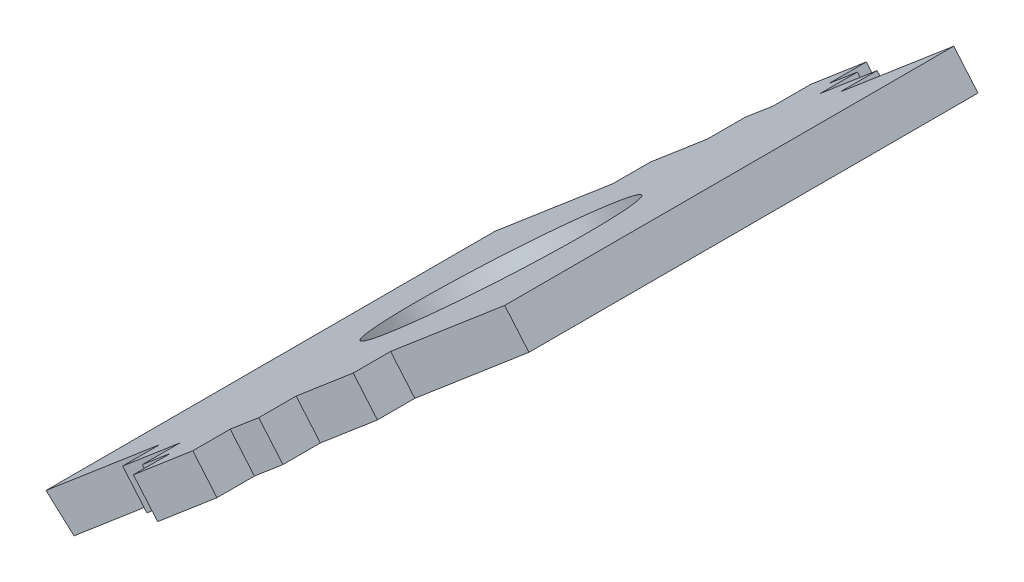
ISO-10303-21;
HEADER;
FILE_DESCRIPTION(('STEP AP214'),'2;1');
FILE_NAME('part.step','',(''),(''),'','','');
FILE_SCHEMA(('AUTOMOTIVE_DESIGN { 1 0 10303 214 1 1 1 1 }'));
ENDSEC;
DATA;
#1=APPLICATION_CONTEXT('core data for automotive mechanical design processes');
#2=APPLICATION_PROTOCOL_DEFINITION('international standard','automotive_design',2000,#1);
#3=PRODUCT_CONTEXT('',#1,'mechanical');
#4=PRODUCT('Part','Part','',(#3));
#5=PRODUCT_RELATED_PRODUCT_CATEGORY('part','',(#4));
#6=PRODUCT_DEFINITION_FORMATION('','',#4);
#7=PRODUCT_DEFINITION_CONTEXT('part definition',#1,'design');
#8=PRODUCT_DEFINITION('design','',#6,#7);
#9=PRODUCT_DEFINITION_SHAPE('','',#8);
#10=(LENGTH_UNIT() NAMED_UNIT(*) SI_UNIT(.MILLI.,.METRE.));
#11=(NAMED_UNIT(*) PLANE_ANGLE_UNIT() SI_UNIT($,.RADIAN.));
#12=(NAMED_UNIT(*) SI_UNIT($,.STERADIAN.) SOLID_ANGLE_UNIT());
#13=UNCERTAINTY_MEASURE_WITH_UNIT(LENGTH_MEASURE(1.E-05),#10,'distance_accuracy_value','');
#14=(GEOMETRIC_REPRESENTATION_CONTEXT(3) GLOBAL_UNCERTAINTY_ASSIGNED_CONTEXT((#13)) GLOBAL_UNIT_ASSIGNED_CONTEXT((#10,
#11,#12)) REPRESENTATION_CONTEXT('',''));
#15=CARTESIAN_POINT('',(0.,0.,0.));
#16=DIRECTION('',(0.,0.,1.));
#17=DIRECTION('',(1.,0.,0.));
#18=AXIS2_PLACEMENT_3D('',#15,#16,#17);
#19=CARTESIAN_POINT('',(-106.481154517349,295.978206086416,-9.525));
#20=DIRECTION('',(-0.762165840447724,-0.647381828332101,0.));
#21=DIRECTION('',(0.647381828332101,-0.762165840447724,0.));
#22=AXIS2_PLACEMENT_3D('',#19,#20,#21);
#23=PLANE('',#22);
#24=DIRECTION('',(0.,0.,1.));
#25=VECTOR('',#24,1.);
#26=CARTESIAN_POINT('',(-106.481154517349,295.978206086416,-9.525));
#27=LINE('',#26,#25);
#28=CARTESIAN_POINT('',(-106.481154517349,295.978206086416,0.));
#29=VERTEX_POINT('',#28);
#30=CARTESIAN_POINT('',(-106.481154517349,295.978206086416,38.1));
#31=VERTEX_POINT('',#30);
#32=EDGE_CURVE('E374',#29,#31,#27,.T.);
#33=ORIENTED_EDGE('',*,*,#32,.T.);
#34=DIRECTION('',(0.647381828332101,-0.762165840447724,0.));
#35=VECTOR('',#34,1.);
#36=CARTESIAN_POINT('',(-106.481154517349,295.978206086416,38.1));
#37=LINE('',#36,#35);
#38=CARTESIAN_POINT('',(-104.425717212394,293.558329542994,38.1));
#39=VERTEX_POINT('',#38);
#40=EDGE_CURVE('E329',#31,#39,#37,.T.);
#41=ORIENTED_EDGE('',*,*,#40,.T.);
#42=DIRECTION('',(0.,0.,1.));
#43=VECTOR('',#42,1.);
#44=CARTESIAN_POINT('',(-104.425717212394,293.558329542994,-9.525));
#45=LINE('',#44,#43);
#46=CARTESIAN_POINT('',(-104.425717212394,293.558329542994,0.));
#47=VERTEX_POINT('',#46);
#48=EDGE_CURVE('E382',#47,#39,#45,.T.);
#49=ORIENTED_EDGE('',*,*,#48,.F.);
#50=DIRECTION('',(-0.647381828332101,0.762165840447724,0.));
#51=VECTOR('',#50,1.);
#52=CARTESIAN_POINT('',(-106.481154517349,295.978206086416,0.));
#53=LINE('',#52,#51);
#54=EDGE_CURVE('E362',#47,#29,#53,.T.);
#55=ORIENTED_EDGE('',*,*,#54,.T.);
#56=EDGE_LOOP('',(#33,#41,#49,#55));
#57=FACE_BOUND('',#56,.T.);
#58=ADVANCED_FACE('F33',(#57),#23,.F.);
#59=CARTESIAN_POINT('',(-104.425717212394,293.558329542994,-9.525));
#60=DIRECTION('',(-0.647381828332102,0.762165840447724,0.));
#61=DIRECTION('',(-0.762165840447724,-0.647381828332102,0.));
#62=AXIS2_PLACEMENT_3D('',#59,#60,#61);
#63=PLANE('',#62);
#64=CARTESIAN_POINT('',(-123.784729559767,277.114831103359,19.05));
#65=DIRECTION('',(0.647381828332102,-0.762165840447724,0.));
#66=DIRECTION('',(0.762165840447724,0.647381828332102,0.));
#67=AXIS2_PLACEMENT_3D('',#64,#65,#66);
#68=CIRCLE('',#67,9.52500000000003);
#69=CARTESIAN_POINT('',(-116.525099929502,283.281143018222,19.05));
#70=VERTEX_POINT('',#69);
#71=EDGE_CURVE('E798',#70,#70,#68,.T.);
#72=ORIENTED_EDGE('',*,*,#71,.F.);
#73=EDGE_LOOP('',(#72));
#74=FACE_BOUND('',#73,.T.);
#75=DIRECTION('',(-0.762165840447724,-0.647381828332101,0.));
#76=VECTOR('',#75,1.);
#77=CARTESIAN_POINT('',(-104.425717212394,293.558329542994,47.625));
#78=LINE('',#77,#76);
#79=CARTESIAN_POINT('',(-121.364853016345,279.170268408313,47.625));
#80=VERTEX_POINT('',#79);
#81=CARTESIAN_POINT('',(-126.403407566219,274.890532314745,47.625));
#82=VERTEX_POINT('',#81);
#83=EDGE_CURVE('E365',#80,#82,#78,.T.);
#84=ORIENTED_EDGE('',*,*,#83,.T.);
#85=DIRECTION('',(0.,0.,1.));
#86=VECTOR('',#85,1.);
#87=CARTESIAN_POINT('',(-126.403407566219,274.890532314745,47.625));
#88=LINE('',#87,#86);
#89=CARTESIAN_POINT('',(-126.403407566219,274.890532314745,44.4499999992842));
#90=VERTEX_POINT('',#89);
#91=EDGE_CURVE('E48',#90,#82,#88,.T.);
#92=ORIENTED_EDGE('',*,*,#91,.F.);
#93=DIRECTION('',(0.76216584044772,0.647381828332106,0.));
#94=VECTOR('',#93,1.);
#95=CARTESIAN_POINT('',(-128.823284109641,272.835095009791,44.4499999992842));
#96=LINE('',#95,#94);
#97=CARTESIAN_POINT('',(-128.823284109641,272.835095009791,44.4499999992842));
#98=VERTEX_POINT('',#97);
#99=EDGE_CURVE('E253',#98,#90,#96,.T.);
#100=ORIENTED_EDGE('',*,*,#99,.F.);
#101=DIRECTION('',(0.,0.,1.));
#102=VECTOR('',#101,1.);
#103=CARTESIAN_POINT('',(-128.823284109641,272.835095009791,44.4499999992842));
#104=LINE('',#103,#102);
#105=CARTESIAN_POINT('',(-128.823284109641,272.835095009791,41.2749999996421));
#106=VERTEX_POINT('',#105);
#107=EDGE_CURVE('E247',#106,#98,#104,.T.);
#108=ORIENTED_EDGE('',*,*,#107,.F.);
#109=DIRECTION('',(0.762165840447724,0.647381828332101,0.));
#110=VECTOR('',#109,1.);
#111=CARTESIAN_POINT('',(-133.663037196484,268.724220399882,41.2749999996421));
#112=LINE('',#111,#110);
#113=CARTESIAN_POINT('',(-133.663037196484,268.724220399882,41.2749999996421));
#114=VERTEX_POINT('',#113);
#115=EDGE_CURVE('E245',#114,#106,#112,.T.);
#116=ORIENTED_EDGE('',*,*,#115,.F.);
#117=DIRECTION('',(0.,0.,1.));
#118=VECTOR('',#117,1.);
#119=CARTESIAN_POINT('',(-133.663037196484,268.724220399882,41.2749999996421));
#120=LINE('',#119,#118);
#121=CARTESIAN_POINT('',(-133.663037196484,268.724220399882,38.1));
#122=VERTEX_POINT('',#121);
#123=EDGE_CURVE('E224',#122,#114,#120,.T.);
#124=ORIENTED_EDGE('',*,*,#123,.F.);
#125=DIRECTION('',(0.762165840447725,0.6473818283321,0.));
#126=VECTOR('',#125,1.);
#127=CARTESIAN_POINT('',(-143.34254337017,260.502471180064,38.1));
#128=LINE('',#127,#126);
#129=CARTESIAN_POINT('',(-143.022728413072,260.774121233985,38.1));
#130=VERTEX_POINT('',#129);
#131=EDGE_CURVE('E233',#130,#122,#128,.T.);
#132=ORIENTED_EDGE('',*,*,#131,.F.);
#133=DIRECTION('',(0.,0.,1.));
#134=VECTOR('',#133,1.);
#135=CARTESIAN_POINT('',(-143.022728413072,260.774121233985,-9.525));
#136=LINE('',#135,#134);
#137=CARTESIAN_POINT('',(-143.022728413072,260.774121233985,0.));
#138=VERTEX_POINT('',#137);
#139=EDGE_CURVE('E380',#138,#130,#136,.T.);
#140=ORIENTED_EDGE('',*,*,#139,.F.);
#141=DIRECTION('',(-0.762165840447721,-0.647381828332105,0.));
#142=VECTOR('',#141,1.);
#143=CARTESIAN_POINT('',(-143.022728413072,260.774121233985,0.));
#144=LINE('',#143,#142);
#145=CARTESIAN_POINT('',(-133.343222239386,268.995870453803,0.));
#146=VERTEX_POINT('',#145);
#147=EDGE_CURVE('E283',#146,#138,#144,.T.);
#148=ORIENTED_EDGE('',*,*,#147,.F.);
#149=DIRECTION('',(0.,0.,1.));
#150=VECTOR('',#149,1.);
#151=CARTESIAN_POINT('',(-133.343222239386,268.995870453803,-3.17499999964209));
#152=LINE('',#151,#150);
#153=CARTESIAN_POINT('',(-133.343222239386,268.995870453803,-3.17499999964209));
#154=VERTEX_POINT('',#153);
#155=EDGE_CURVE('E280',#154,#146,#152,.T.);
#156=ORIENTED_EDGE('',*,*,#155,.F.);
#157=DIRECTION('',(-0.762165840447724,-0.647381828332101,0.));
#158=VECTOR('',#157,1.);
#159=CARTESIAN_POINT('',(-133.343222239386,268.995870453803,-3.17499999964209));
#160=LINE('',#159,#158);
#161=CARTESIAN_POINT('',(-128.503469152543,273.106745063712,-3.17499999964209));
#162=VERTEX_POINT('',#161);
#163=EDGE_CURVE('E277',#162,#154,#160,.T.);
#164=ORIENTED_EDGE('',*,*,#163,.F.);
#165=DIRECTION('',(0.,0.,1.));
#166=VECTOR('',#165,1.);
#167=CARTESIAN_POINT('',(-128.503469152543,273.106745063712,-6.34999999928418));
#168=LINE('',#167,#166);
#169=CARTESIAN_POINT('',(-128.503469152543,273.106745063712,-6.34999999928418));
#170=VERTEX_POINT('',#169);
#171=EDGE_CURVE('E274',#170,#162,#168,.T.);
#172=ORIENTED_EDGE('',*,*,#171,.F.);
#173=DIRECTION('',(-0.76216584044772,-0.647381828332106,0.));
#174=VECTOR('',#173,1.);
#175=CARTESIAN_POINT('',(-128.503469152543,273.106745063712,-6.34999999928418));
#176=LINE('',#175,#174);
#177=CARTESIAN_POINT('',(-126.083592609121,275.162182368666,-6.34999999928418));
#178=VERTEX_POINT('',#177);
#179=EDGE_CURVE('E271',#178,#170,#176,.T.);
#180=ORIENTED_EDGE('',*,*,#179,.F.);
#181=DIRECTION('',(0.,0.,1.));
#182=VECTOR('',#181,1.);
#183=CARTESIAN_POINT('',(-126.083592609121,275.162182368666,-9.525));
#184=LINE('',#183,#182);
#185=CARTESIAN_POINT('',(-126.083592609121,275.162182368666,-9.525));
#186=VERTEX_POINT('',#185);
#187=EDGE_CURVE('E268',#186,#178,#184,.T.);
#188=ORIENTED_EDGE('',*,*,#187,.F.);
#189=DIRECTION('',(-0.762165840447724,-0.647381828332101,0.));
#190=VECTOR('',#189,1.);
#191=CARTESIAN_POINT('',(-104.425717212394,293.558329542994,-9.525));
#192=LINE('',#191,#190);
#193=CARTESIAN_POINT('',(-121.364853016345,279.170268408313,-9.525));
#194=VERTEX_POINT('',#193);
#195=EDGE_CURVE('E369',#194,#186,#192,.T.);
#196=ORIENTED_EDGE('',*,*,#195,.F.);
#197=DIRECTION('',(0.,0.,-1.));
#198=VECTOR('',#197,1.);
#199=CARTESIAN_POINT('',(-121.364853016345,279.170268408313,-9.525));
#200=LINE('',#199,#198);
#201=CARTESIAN_POINT('',(-121.364853016345,279.170268408313,-6.34999999928418));
#202=VERTEX_POINT('',#201);
#203=EDGE_CURVE('E347',#202,#194,#200,.T.);
#204=ORIENTED_EDGE('',*,*,#203,.F.);
#205=DIRECTION('',(-0.76216584044772,-0.647381828332106,0.));
#206=VECTOR('',#205,1.);
#207=CARTESIAN_POINT('',(-118.944976472923,281.225705713268,-6.34999999928418));
#208=LINE('',#207,#206);
#209=CARTESIAN_POINT('',(-118.944976472923,281.225705713268,-6.34999999928418));
#210=VERTEX_POINT('',#209);
#211=EDGE_CURVE('E344',#210,#202,#208,.T.);
#212=ORIENTED_EDGE('',*,*,#211,.F.);
#213=DIRECTION('',(0.,0.,-1.));
#214=VECTOR('',#213,1.);
#215=CARTESIAN_POINT('',(-118.944976472923,281.225705713268,-6.34999999928418));
#216=LINE('',#215,#214);
#217=CARTESIAN_POINT('',(-118.944976472923,281.225705713268,-3.17499999964209));
#218=VERTEX_POINT('',#217);
#219=EDGE_CURVE('E341',#218,#210,#216,.T.);
#220=ORIENTED_EDGE('',*,*,#219,.F.);
#221=DIRECTION('',(-0.762165840447724,-0.647381828332101,0.));
#222=VECTOR('',#221,1.);
#223=CARTESIAN_POINT('',(-114.10522338608,285.336580323177,-3.17499999964209));
#224=LINE('',#223,#222);
#225=CARTESIAN_POINT('',(-114.10522338608,285.336580323177,-3.17499999964209));
#226=VERTEX_POINT('',#225);
#227=EDGE_CURVE('E338',#226,#218,#224,.T.);
#228=ORIENTED_EDGE('',*,*,#227,.F.);
#229=DIRECTION('',(0.,0.,-1.));
#230=VECTOR('',#229,1.);
#231=CARTESIAN_POINT('',(-114.10522338608,285.336580323177,-3.17499999964209));
#232=LINE('',#231,#230);
#233=CARTESIAN_POINT('',(-114.10522338608,285.336580323177,0.));
#234=VERTEX_POINT('',#233);
#235=EDGE_CURVE('E335',#234,#226,#232,.T.);
#236=ORIENTED_EDGE('',*,*,#235,.F.);
#237=DIRECTION('',(-0.762165840447725,-0.6473818283321,0.));
#238=VECTOR('',#237,1.);
#239=CARTESIAN_POINT('',(-104.425717212394,293.558329542994,0.));
#240=LINE('',#239,#238);
#241=EDGE_CURVE('E332',#47,#234,#240,.T.);
#242=ORIENTED_EDGE('',*,*,#241,.F.);
#243=ORIENTED_EDGE('',*,*,#48,.T.);
#244=DIRECTION('',(0.762165840447721,0.647381828332105,0.));
#245=VECTOR('',#244,1.);
#246=CARTESIAN_POINT('',(-104.425717212394,293.558329542994,38.1));
#247=LINE('',#246,#245);
#248=CARTESIAN_POINT('',(-114.10522338608,285.336580323177,38.1));
#249=VERTEX_POINT('',#248);
#250=EDGE_CURVE('E314',#249,#39,#247,.T.);
#251=ORIENTED_EDGE('',*,*,#250,.F.);
#252=DIRECTION('',(0.,0.,-1.));
#253=VECTOR('',#252,1.);
#254=CARTESIAN_POINT('',(-114.10522338608,285.336580323177,41.2749999996421));
#255=LINE('',#254,#253);
#256=CARTESIAN_POINT('',(-114.10522338608,285.336580323177,41.2749999996421));
#257=VERTEX_POINT('',#256);
#258=EDGE_CURVE('E311',#257,#249,#255,.T.);
#259=ORIENTED_EDGE('',*,*,#258,.F.);
#260=DIRECTION('',(0.762165840447724,0.647381828332101,0.));
#261=VECTOR('',#260,1.);
#262=CARTESIAN_POINT('',(-114.10522338608,285.336580323177,41.2749999996421));
#263=LINE('',#262,#261);
#264=CARTESIAN_POINT('',(-118.944976472923,281.225705713268,41.2749999996421));
#265=VERTEX_POINT('',#264);
#266=EDGE_CURVE('E308',#265,#257,#263,.T.);
#267=ORIENTED_EDGE('',*,*,#266,.F.);
#268=DIRECTION('',(0.,0.,-1.));
#269=VECTOR('',#268,1.);
#270=CARTESIAN_POINT('',(-118.944976472923,281.225705713268,44.4499999992842));
#271=LINE('',#270,#269);
#272=CARTESIAN_POINT('',(-118.944976472923,281.225705713268,44.4499999992842));
#273=VERTEX_POINT('',#272);
#274=EDGE_CURVE('E305',#273,#265,#271,.T.);
#275=ORIENTED_EDGE('',*,*,#274,.F.);
#276=DIRECTION('',(0.76216584044772,0.647381828332106,0.));
#277=VECTOR('',#276,1.);
#278=CARTESIAN_POINT('',(-118.944976472923,281.225705713268,44.4499999992842));
#279=LINE('',#278,#277);
#280=CARTESIAN_POINT('',(-121.364853016345,279.170268408313,44.4499999992842));
#281=VERTEX_POINT('',#280);
#282=EDGE_CURVE('E302',#281,#273,#279,.T.);
#283=ORIENTED_EDGE('',*,*,#282,.F.);
#284=DIRECTION('',(0.,0.,-1.));
#285=VECTOR('',#284,1.);
#286=CARTESIAN_POINT('',(-121.364853016345,279.170268408313,47.625));
#287=LINE('',#286,#285);
#288=EDGE_CURVE('E299',#80,#281,#287,.T.);
#289=ORIENTED_EDGE('',*,*,#288,.F.);
#290=EDGE_LOOP('',(#84,#92,#100,#108,#116,#124,#132,#140,#148,#156,#164,#172,#180,#188,#196,
#204,#212,#220,#228,#236,#242,#243,#251,#259,#267,#275,#283,#289));
#291=FACE_BOUND('',#290,.T.);
#292=ADVANCED_FACE('F242',(#74,#291),#63,.F.);
#293=CARTESIAN_POINT('',(-143.022728413072,260.774121233985,-9.525));
#294=DIRECTION('',(0.670774020010388,0.741661792247048,0.));
#295=DIRECTION('',(-0.741661792247048,0.670774020010388,0.));
#296=AXIS2_PLACEMENT_3D('',#293,#294,#295);
#297=PLANE('',#296);
#298=ORIENTED_EDGE('',*,*,#139,.T.);
#299=DIRECTION('',(-0.741661792247048,0.670774020010388,0.));
#300=VECTOR('',#299,1.);
#301=CARTESIAN_POINT('',(-143.022728413072,260.774121233985,38.1));
#302=LINE('',#301,#300);
#303=CARTESIAN_POINT('',(-145.397980675125,262.922347723486,38.1));
#304=VERTEX_POINT('',#303);
#305=EDGE_CURVE('E236',#130,#304,#302,.T.);
#306=ORIENTED_EDGE('',*,*,#305,.T.);
#307=DIRECTION('',(0.,0.,1.));
#308=VECTOR('',#307,1.);
#309=CARTESIAN_POINT('',(-145.397980675125,262.922347723486,-9.525));
#310=LINE('',#309,#308);
#311=CARTESIAN_POINT('',(-145.397980675125,262.922347723486,0.));
#312=VERTEX_POINT('',#311);
#313=EDGE_CURVE('E377',#312,#304,#310,.T.);
#314=ORIENTED_EDGE('',*,*,#313,.F.);
#315=DIRECTION('',(0.741661792247048,-0.670774020010388,0.));
#316=VECTOR('',#315,1.);
#317=CARTESIAN_POINT('',(-143.022728413072,260.774121233985,0.));
#318=LINE('',#317,#316);
#319=EDGE_CURVE('E296',#312,#138,#318,.T.);
#320=ORIENTED_EDGE('',*,*,#319,.T.);
#321=EDGE_LOOP('',(#298,#306,#314,#320));
#322=FACE_BOUND('',#321,.T.);
#323=ADVANCED_FACE('F541',(#322),#297,.F.);
#324=CARTESIAN_POINT('',(-145.397980675125,262.922347723486,-9.525));
#325=DIRECTION('',(0.647381828332102,-0.762165840447724,0.));
#326=DIRECTION('',(0.762165840447724,0.647381828332102,0.));
#327=AXIS2_PLACEMENT_3D('',#324,#325,#326);
#328=PLANE('',#327);
#329=CARTESIAN_POINT('',(-125.840166864721,279.534707646781,19.05));
#330=DIRECTION('',(0.647381828332102,-0.762165840447724,0.));
#331=DIRECTION('',(0.762165840447724,0.647381828332102,0.));
#332=AXIS2_PLACEMENT_3D('',#329,#330,#331);
#333=CIRCLE('',#332,9.52500000000003);
#334=CARTESIAN_POINT('',(-118.580537234456,285.701019561644,19.05));
#335=VERTEX_POINT('',#334);
#336=EDGE_CURVE('E36',#335,#335,#333,.T.);
#337=ORIENTED_EDGE('',*,*,#336,.T.);
#338=EDGE_LOOP('',(#337));
#339=FACE_BOUND('',#338,.T.);
#340=DIRECTION('',(0.762165840447724,0.647381828332102,0.));
#341=VECTOR('',#340,1.);
#342=CARTESIAN_POINT('',(-145.397980675125,262.922347723486,44.4499999992842));
#343=LINE('',#342,#341);
#344=CARTESIAN_POINT('',(-130.878721414595,275.254971553212,44.4499999992842));
#345=VERTEX_POINT('',#344);
#346=CARTESIAN_POINT('',(-128.458844871174,277.310408858167,44.4499999992842));
#347=VERTEX_POINT('',#346);
#348=EDGE_CURVE('E11',#345,#347,#343,.T.);
#349=ORIENTED_EDGE('',*,*,#348,.T.);
#350=DIRECTION('',(0.,0.,1.));
#351=VECTOR('',#350,1.);
#352=CARTESIAN_POINT('',(-128.458844871174,277.310408858167,-9.525));
#353=LINE('',#352,#351);
#354=CARTESIAN_POINT('',(-128.458844871174,277.310408858167,47.625));
#355=VERTEX_POINT('',#354);
#356=EDGE_CURVE('E259',#347,#355,#353,.T.);
#357=ORIENTED_EDGE('',*,*,#356,.T.);
#358=DIRECTION('',(0.762165840447724,0.647381828332102,0.));
#359=VECTOR('',#358,1.);
#360=CARTESIAN_POINT('',(-145.397980675125,262.922347723486,47.625));
#361=LINE('',#360,#359);
#362=CARTESIAN_POINT('',(-123.420290321299,281.590144951735,47.625));
#363=VERTEX_POINT('',#362);
#364=EDGE_CURVE('E367',#355,#363,#361,.T.);
#365=ORIENTED_EDGE('',*,*,#364,.T.);
#366=DIRECTION('',(0.,0.,-1.));
#367=VECTOR('',#366,1.);
#368=CARTESIAN_POINT('',(-123.420290321299,281.590144951735,-9.525));
#369=LINE('',#368,#367);
#370=CARTESIAN_POINT('',(-123.420290321299,281.590144951735,44.4499999992842));
#371=VERTEX_POINT('',#370);
#372=EDGE_CURVE('E319',#363,#371,#369,.T.);
#373=ORIENTED_EDGE('',*,*,#372,.T.);
#374=DIRECTION('',(0.762165840447724,0.647381828332102,0.));
#375=VECTOR('',#374,1.);
#376=CARTESIAN_POINT('',(-145.397980675125,262.922347723486,44.4499999992842));
#377=LINE('',#376,#375);
#378=CARTESIAN_POINT('',(-121.000413777878,283.645582256689,44.4499999992842));
#379=VERTEX_POINT('',#378);
#380=EDGE_CURVE('E406',#371,#379,#377,.T.);
#381=ORIENTED_EDGE('',*,*,#380,.T.);
#382=DIRECTION('',(0.,0.,-1.));
#383=VECTOR('',#382,1.);
#384=CARTESIAN_POINT('',(-121.000413777878,283.645582256689,-9.525));
#385=LINE('',#384,#383);
#386=CARTESIAN_POINT('',(-121.000413777878,283.645582256689,41.2749999996421));
#387=VERTEX_POINT('',#386);
#388=EDGE_CURVE('E409',#379,#387,#385,.T.);
#389=ORIENTED_EDGE('',*,*,#388,.T.);
#390=DIRECTION('',(0.762165840447724,0.647381828332102,0.));
#391=VECTOR('',#390,1.);
#392=CARTESIAN_POINT('',(-145.397980675125,262.922347723486,41.2749999996421));
#393=LINE('',#392,#391);
#394=CARTESIAN_POINT('',(-116.160660691035,287.756456866598,41.2749999996421));
#395=VERTEX_POINT('',#394);
#396=EDGE_CURVE('E412',#387,#395,#393,.T.);
#397=ORIENTED_EDGE('',*,*,#396,.T.);
#398=DIRECTION('',(0.,0.,-1.));
#399=VECTOR('',#398,1.);
#400=CARTESIAN_POINT('',(-116.160660691035,287.756456866598,-9.525));
#401=LINE('',#400,#399);
#402=CARTESIAN_POINT('',(-116.160660691035,287.756456866598,38.1));
#403=VERTEX_POINT('',#402);
#404=EDGE_CURVE('E415',#395,#403,#401,.T.);
#405=ORIENTED_EDGE('',*,*,#404,.T.);
#406=DIRECTION('',(0.762165840447724,0.647381828332102,0.));
#407=VECTOR('',#406,1.);
#408=CARTESIAN_POINT('',(-145.397980675125,262.922347723486,38.1));
#409=LINE('',#408,#407);
#410=EDGE_CURVE('E418',#403,#31,#409,.T.);
#411=ORIENTED_EDGE('',*,*,#410,.T.);
#412=ORIENTED_EDGE('',*,*,#32,.F.);
#413=DIRECTION('',(-0.762165840447724,-0.647381828332102,0.));
#414=VECTOR('',#413,1.);
#415=CARTESIAN_POINT('',(-145.397980675125,262.922347723486,0.));
#416=LINE('',#415,#414);
#417=CARTESIAN_POINT('',(-116.160660691035,287.756456866598,0.));
#418=VERTEX_POINT('',#417);
#419=EDGE_CURVE('E388',#29,#418,#416,.T.);
#420=ORIENTED_EDGE('',*,*,#419,.T.);
#421=DIRECTION('',(0.,0.,-1.));
#422=VECTOR('',#421,1.);
#423=CARTESIAN_POINT('',(-116.160660691035,287.756456866598,-9.525));
#424=LINE('',#423,#422);
#425=CARTESIAN_POINT('',(-116.160660691035,287.756456866598,-3.17499999964209));
#426=VERTEX_POINT('',#425);
#427=EDGE_CURVE('E391',#418,#426,#424,.T.);
#428=ORIENTED_EDGE('',*,*,#427,.T.);
#429=DIRECTION('',(-0.762165840447724,-0.647381828332102,0.));
#430=VECTOR('',#429,1.);
#431=CARTESIAN_POINT('',(-145.397980675125,262.922347723486,-3.17499999964208));
#432=LINE('',#431,#430);
#433=CARTESIAN_POINT('',(-121.000413777878,283.645582256689,-3.17499999964209));
#434=VERTEX_POINT('',#433);
#435=EDGE_CURVE('E394',#426,#434,#432,.T.);
#436=ORIENTED_EDGE('',*,*,#435,.T.);
#437=DIRECTION('',(0.,0.,-1.));
#438=VECTOR('',#437,1.);
#439=CARTESIAN_POINT('',(-121.000413777878,283.645582256689,-9.525));
#440=LINE('',#439,#438);
#441=CARTESIAN_POINT('',(-121.000413777878,283.645582256689,-6.34999999928418));
#442=VERTEX_POINT('',#441);
#443=EDGE_CURVE('E397',#434,#442,#440,.T.);
#444=ORIENTED_EDGE('',*,*,#443,.T.);
#445=DIRECTION('',(-0.762165840447724,-0.647381828332102,0.));
#446=VECTOR('',#445,1.);
#447=CARTESIAN_POINT('',(-145.397980675125,262.922347723486,-6.34999999928416));
#448=LINE('',#447,#446);
#449=CARTESIAN_POINT('',(-123.420290321299,281.590144951735,-6.34999999928418));
#450=VERTEX_POINT('',#449);
#451=EDGE_CURVE('E400',#442,#450,#448,.T.);
#452=ORIENTED_EDGE('',*,*,#451,.T.);
#453=DIRECTION('',(0.,0.,-1.));
#454=VECTOR('',#453,1.);
#455=CARTESIAN_POINT('',(-123.420290321299,281.590144951735,-9.525));
#456=LINE('',#455,#454);
#457=CARTESIAN_POINT('',(-123.420290321299,281.590144951735,-9.525));
#458=VERTEX_POINT('',#457);
#459=EDGE_CURVE('E352',#450,#458,#456,.T.);
#460=ORIENTED_EDGE('',*,*,#459,.T.);
#461=DIRECTION('',(0.762165840447724,0.647381828332102,0.));
#462=VECTOR('',#461,1.);
#463=CARTESIAN_POINT('',(-145.397980675125,262.922347723486,-9.525));
#464=LINE('',#463,#462);
#465=CARTESIAN_POINT('',(-128.139029914076,277.582058912088,-9.525));
#466=VERTEX_POINT('',#465);
#467=EDGE_CURVE('E372',#466,#458,#464,.T.);
#468=ORIENTED_EDGE('',*,*,#467,.F.);
#469=DIRECTION('',(0.,0.,1.));
#470=VECTOR('',#469,1.);
#471=CARTESIAN_POINT('',(-128.139029914076,277.582058912088,-9.525));
#472=LINE('',#471,#470);
#473=CARTESIAN_POINT('',(-128.139029914076,277.582058912088,-6.34999999928418));
#474=VERTEX_POINT('',#473);
#475=EDGE_CURVE('E56',#466,#474,#472,.T.);
#476=ORIENTED_EDGE('',*,*,#475,.T.);
#477=DIRECTION('',(-0.762165840447724,-0.647381828332102,0.));
#478=VECTOR('',#477,1.);
#479=CARTESIAN_POINT('',(-145.397980675125,262.922347723486,-6.34999999928418));
#480=LINE('',#479,#478);
#481=CARTESIAN_POINT('',(-130.558906457497,275.526621607133,-6.34999999928418));
#482=VERTEX_POINT('',#481);
#483=EDGE_CURVE('E423',#474,#482,#480,.T.);
#484=ORIENTED_EDGE('',*,*,#483,.T.);
#485=DIRECTION('',(0.,0.,1.));
#486=VECTOR('',#485,1.);
#487=CARTESIAN_POINT('',(-130.558906457497,275.526621607133,-9.525));
#488=LINE('',#487,#486);
#489=CARTESIAN_POINT('',(-130.558906457497,275.526621607133,-3.17499999964209));
#490=VERTEX_POINT('',#489);
#491=EDGE_CURVE('E426',#482,#490,#488,.T.);
#492=ORIENTED_EDGE('',*,*,#491,.T.);
#493=DIRECTION('',(-0.762165840447724,-0.647381828332102,0.));
#494=VECTOR('',#493,1.);
#495=CARTESIAN_POINT('',(-145.397980675125,262.922347723486,-3.17499999964209));
#496=LINE('',#495,#494);
#497=CARTESIAN_POINT('',(-135.39865954434,271.415746997224,-3.17499999964209));
#498=VERTEX_POINT('',#497);
#499=EDGE_CURVE('E429',#490,#498,#496,.T.);
#500=ORIENTED_EDGE('',*,*,#499,.T.);
#501=DIRECTION('',(0.,0.,1.));
#502=VECTOR('',#501,1.);
#503=CARTESIAN_POINT('',(-135.39865954434,271.415746997224,-9.525));
#504=LINE('',#503,#502);
#505=CARTESIAN_POINT('',(-135.39865954434,271.415746997224,0.));
#506=VERTEX_POINT('',#505);
#507=EDGE_CURVE('E432',#498,#506,#504,.T.);
#508=ORIENTED_EDGE('',*,*,#507,.T.);
#509=DIRECTION('',(-0.762165840447724,-0.647381828332102,0.));
#510=VECTOR('',#509,1.);
#511=CARTESIAN_POINT('',(-145.397980675125,262.922347723486,0.));
#512=LINE('',#511,#510);
#513=EDGE_CURVE('E435',#506,#312,#512,.T.);
#514=ORIENTED_EDGE('',*,*,#513,.T.);
#515=ORIENTED_EDGE('',*,*,#313,.T.);
#516=DIRECTION('',(0.762165840447724,0.647381828332102,0.));
#517=VECTOR('',#516,1.);
#518=CARTESIAN_POINT('',(-145.397980675125,262.922347723486,38.1));
#519=LINE('',#518,#517);
#520=CARTESIAN_POINT('',(-135.718474501438,271.144096943304,38.1));
#521=VERTEX_POINT('',#520);
#522=EDGE_CURVE('E440',#304,#521,#519,.T.);
#523=ORIENTED_EDGE('',*,*,#522,.T.);
#524=DIRECTION('',(0.,0.,1.));
#525=VECTOR('',#524,1.);
#526=CARTESIAN_POINT('',(-135.718474501438,271.144096943304,-9.525));
#527=LINE('',#526,#525);
#528=CARTESIAN_POINT('',(-135.718474501438,271.144096943304,41.2749999996421));
#529=VERTEX_POINT('',#528);
#530=EDGE_CURVE('E227',#521,#529,#527,.T.);
#531=ORIENTED_EDGE('',*,*,#530,.T.);
#532=DIRECTION('',(0.762165840447724,0.647381828332102,0.));
#533=VECTOR('',#532,1.);
#534=CARTESIAN_POINT('',(-145.397980675125,262.922347723486,41.2749999996421));
#535=LINE('',#534,#533);
#536=CARTESIAN_POINT('',(-130.878721414595,275.254971553212,41.2749999996421));
#537=VERTEX_POINT('',#536);
#538=EDGE_CURVE('E443',#529,#537,#535,.T.);
#539=ORIENTED_EDGE('',*,*,#538,.T.);
#540=DIRECTION('',(0.,0.,1.));
#541=VECTOR('',#540,1.);
#542=CARTESIAN_POINT('',(-130.878721414595,275.254971553212,-9.525));
#543=LINE('',#542,#541);
#544=EDGE_CURVE('E41',#537,#345,#543,.T.);
#545=ORIENTED_EDGE('',*,*,#544,.T.);
#546=EDGE_LOOP('',(#349,#357,#365,#373,#381,#389,#397,#405,#411,#412,#420,#428,#436,#444,#452,
#460,#468,#476,#484,#492,#500,#508,#514,#515,#523,#531,#539,#545));
#547=FACE_BOUND('',#546,.T.);
#548=ADVANCED_FACE('F448',(#339,#547),#328,.F.);
#549=CARTESIAN_POINT('',(0.,0.,-9.525));
#550=DIRECTION('',(0.,0.,-1.));
#551=DIRECTION('',(-1.,0.,0.));
#552=AXIS2_PLACEMENT_3D('',#549,#550,#551);
#553=PLANE('',#552);
#554=DIRECTION('',(0.647381828332102,-0.762165840447724,0.));
#555=VECTOR('',#554,1.);
#556=CARTESIAN_POINT('',(62.5268579923697,53.1101625115911,-9.525));
#557=LINE('',#556,#555);
#558=EDGE_CURVE('E421',#466,#186,#557,.T.);
#559=ORIENTED_EDGE('',*,*,#558,.F.);
#560=ORIENTED_EDGE('',*,*,#467,.T.);
#561=DIRECTION('',(-0.647381828332102,0.762165840447724,0.));
#562=VECTOR('',#561,1.);
#563=CARTESIAN_POINT('',(67.2455975851461,57.1182485512384,-9.525));
#564=LINE('',#563,#562);
#565=EDGE_CURVE('E385',#194,#458,#564,.T.);
#566=ORIENTED_EDGE('',*,*,#565,.F.);
#567=ORIENTED_EDGE('',*,*,#195,.T.);
#568=EDGE_LOOP('',(#559,#560,#566,#567));
#569=FACE_BOUND('',#568,.T.);
#570=ADVANCED_FACE('F517',(#569),#553,.T.);
#571=CARTESIAN_POINT('',(0.,0.,47.625));
#572=DIRECTION('',(0.,0.,-1.));
#573=DIRECTION('',(-1.,0.,0.));
#574=AXIS2_PLACEMENT_3D('',#571,#572,#573);
#575=PLANE('',#574);
#576=ORIENTED_EDGE('',*,*,#364,.F.);
#577=DIRECTION('',(0.647381828332102,-0.762165840447724,0.));
#578=VECTOR('',#577,1.);
#579=CARTESIAN_POINT('',(62.2070430352716,52.8385124576704,47.625));
#580=LINE('',#579,#578);
#581=EDGE_CURVE('E438',#355,#82,#580,.T.);
#582=ORIENTED_EDGE('',*,*,#581,.T.);
#583=ORIENTED_EDGE('',*,*,#83,.F.);
#584=DIRECTION('',(-0.647381828332102,0.762165840447724,0.));
#585=VECTOR('',#584,1.);
#586=CARTESIAN_POINT('',(67.2455975851461,57.1182485512384,47.625));
#587=LINE('',#586,#585);
#588=EDGE_CURVE('E403',#80,#363,#587,.T.);
#589=ORIENTED_EDGE('',*,*,#588,.T.);
#590=EDGE_LOOP('',(#576,#582,#583,#589));
#591=FACE_BOUND('',#590,.T.);
#592=ADVANCED_FACE('F463',(#591),#575,.F.);
#593=CARTESIAN_POINT('',(-137.310581386343,302.847623554598,-6.34999999928418));
#594=DIRECTION('',(0.,0.,1.));
#595=DIRECTION('',(1.,0.,0.));
#596=AXIS2_PLACEMENT_3D('',#593,#594,#595);
#597=PLANE('',#596);
#598=DIRECTION('',(0.647381828332102,-0.762165840447724,0.));
#599=VECTOR('',#598,1.);
#600=CARTESIAN_POINT('',(-137.310581386343,302.847623554598,-6.34999999928418));
#601=LINE('',#600,#599);
#602=EDGE_CURVE('E353',#442,#210,#601,.T.);
#603=ORIENTED_EDGE('',*,*,#602,.T.);
#604=ORIENTED_EDGE('',*,*,#211,.T.);
#605=DIRECTION('',(0.647381828332102,-0.762165840447724,0.));
#606=VECTOR('',#605,1.);
#607=CARTESIAN_POINT('',(-139.730457929764,300.792186249644,-6.34999999928418));
#608=LINE('',#607,#606);
#609=EDGE_CURVE('E350',#450,#202,#608,.T.);
#610=ORIENTED_EDGE('',*,*,#609,.F.);
#611=ORIENTED_EDGE('',*,*,#451,.F.);
#612=EDGE_LOOP('',(#603,#604,#610,#611));
#613=FACE_BOUND('',#612,.T.);
#614=ADVANCED_FACE('F508',(#613),#597,.F.);
#615=CARTESIAN_POINT('',(-137.310581386343,302.847623554598,-6.34999999928418));
#616=DIRECTION('',(-0.762165840447724,-0.647381828332102,0.));
#617=DIRECTION('',(0.647381828332102,-0.762165840447724,0.));
#618=AXIS2_PLACEMENT_3D('',#615,#616,#617);
#619=PLANE('',#618);
#620=DIRECTION('',(0.647381828332102,-0.762165840447724,0.));
#621=VECTOR('',#620,1.);
#622=CARTESIAN_POINT('',(-137.310581386343,302.847623554598,-3.17499999964209));
#623=LINE('',#622,#621);
#624=EDGE_CURVE('E355',#434,#218,#623,.T.);
#625=ORIENTED_EDGE('',*,*,#624,.T.);
#626=ORIENTED_EDGE('',*,*,#219,.T.);
#627=ORIENTED_EDGE('',*,*,#602,.F.);
#628=ORIENTED_EDGE('',*,*,#443,.F.);
#629=EDGE_LOOP('',(#625,#626,#627,#628));
#630=FACE_BOUND('',#629,.T.);
#631=ADVANCED_FACE('F504',(#630),#619,.F.);
#632=CARTESIAN_POINT('',(-132.4708282995,306.958498164507,-3.17499999964209));
#633=DIRECTION('',(0.,0.,1.));
#634=DIRECTION('',(1.,0.,0.));
#635=AXIS2_PLACEMENT_3D('',#632,#633,#634);
#636=PLANE('',#635);
#637=DIRECTION('',(0.647381828332102,-0.762165840447724,0.));
#638=VECTOR('',#637,1.);
#639=CARTESIAN_POINT('',(-132.4708282995,306.958498164507,-3.17499999964209));
#640=LINE('',#639,#638);
#641=EDGE_CURVE('E357',#426,#226,#640,.T.);
#642=ORIENTED_EDGE('',*,*,#641,.T.);
#643=ORIENTED_EDGE('',*,*,#227,.T.);
#644=ORIENTED_EDGE('',*,*,#624,.F.);
#645=ORIENTED_EDGE('',*,*,#435,.F.);
#646=EDGE_LOOP('',(#642,#643,#644,#645));
#647=FACE_BOUND('',#646,.T.);
#648=ADVANCED_FACE('F502',(#647),#636,.F.);
#649=CARTESIAN_POINT('',(-132.4708282995,306.958498164507,-3.17499999964209));
#650=DIRECTION('',(-0.762165840447724,-0.647381828332102,0.));
#651=DIRECTION('',(0.647381828332102,-0.762165840447724,0.));
#652=AXIS2_PLACEMENT_3D('',#649,#650,#651);
#653=PLANE('',#652);
#654=DIRECTION('',(0.647381828332102,-0.762165840447724,0.));
#655=VECTOR('',#654,1.);
#656=CARTESIAN_POINT('',(-132.4708282995,306.958498164507,0.));
#657=LINE('',#656,#655);
#658=EDGE_CURVE('E349',#418,#234,#657,.T.);
#659=ORIENTED_EDGE('',*,*,#658,.T.);
#660=ORIENTED_EDGE('',*,*,#235,.T.);
#661=ORIENTED_EDGE('',*,*,#641,.F.);
#662=ORIENTED_EDGE('',*,*,#427,.F.);
#663=EDGE_LOOP('',(#659,#660,#661,#662));
#664=FACE_BOUND('',#663,.T.);
#665=ADVANCED_FACE('F499',(#664),#653,.F.);
#666=CARTESIAN_POINT('',(-122.791322125813,315.180247384325,0.));
#667=DIRECTION('',(0.,0.,1.));
#668=DIRECTION('',(1.,0.,0.));
#669=AXIS2_PLACEMENT_3D('',#666,#667,#668);
#670=PLANE('',#669);
#671=ORIENTED_EDGE('',*,*,#241,.T.);
#672=ORIENTED_EDGE('',*,*,#658,.F.);
#673=ORIENTED_EDGE('',*,*,#419,.F.);
#674=ORIENTED_EDGE('',*,*,#54,.F.);
#675=EDGE_LOOP('',(#671,#672,#673,#674));
#676=FACE_BOUND('',#675,.T.);
#677=ADVANCED_FACE('F492',(#676),#670,.F.);
#678=CARTESIAN_POINT('',(-139.730457929764,300.792186249644,-9.525));
#679=DIRECTION('',(-0.762165840447724,-0.647381828332102,0.));
#680=DIRECTION('',(0.647381828332102,-0.762165840447724,0.));
#681=AXIS2_PLACEMENT_3D('',#678,#679,#680);
#682=PLANE('',#681);
#683=ORIENTED_EDGE('',*,*,#609,.T.);
#684=ORIENTED_EDGE('',*,*,#203,.T.);
#685=ORIENTED_EDGE('',*,*,#565,.T.);
#686=ORIENTED_EDGE('',*,*,#459,.F.);
#687=EDGE_LOOP('',(#683,#684,#685,#686));
#688=FACE_BOUND('',#687,.T.);
#689=ADVANCED_FACE('F513',(#688),#682,.F.);
#690=CARTESIAN_POINT('',(-122.791322125813,315.180247384325,38.1));
#691=DIRECTION('',(0.,0.,-1.));
#692=DIRECTION('',(-1.,0.,0.));
#693=AXIS2_PLACEMENT_3D('',#690,#691,#692);
#694=PLANE('',#693);
#695=ORIENTED_EDGE('',*,*,#410,.F.);
#696=DIRECTION('',(0.647381828332102,-0.762165840447724,0.));
#697=VECTOR('',#696,1.);
#698=CARTESIAN_POINT('',(-132.4708282995,306.958498164507,38.1));
#699=LINE('',#698,#697);
#700=EDGE_CURVE('E317',#403,#249,#699,.T.);
#701=ORIENTED_EDGE('',*,*,#700,.T.);
#702=ORIENTED_EDGE('',*,*,#250,.T.);
#703=ORIENTED_EDGE('',*,*,#40,.F.);
#704=EDGE_LOOP('',(#695,#701,#702,#703));
#705=FACE_BOUND('',#704,.T.);
#706=ADVANCED_FACE('F634',(#705),#694,.F.);
#707=CARTESIAN_POINT('',(-132.4708282995,306.958498164507,41.2749999996421));
#708=DIRECTION('',(-0.762165840447724,-0.647381828332102,0.));
#709=DIRECTION('',(0.647381828332102,-0.762165840447724,0.));
#710=AXIS2_PLACEMENT_3D('',#707,#708,#709);
#711=PLANE('',#710);
#712=DIRECTION('',(0.647381828332102,-0.762165840447724,0.));
#713=VECTOR('',#712,1.);
#714=CARTESIAN_POINT('',(-132.4708282995,306.958498164507,41.2749999996421));
#715=LINE('',#714,#713);
#716=EDGE_CURVE('E320',#395,#257,#715,.T.);
#717=ORIENTED_EDGE('',*,*,#716,.T.);
#718=ORIENTED_EDGE('',*,*,#258,.T.);
#719=ORIENTED_EDGE('',*,*,#700,.F.);
#720=ORIENTED_EDGE('',*,*,#404,.F.);
#721=EDGE_LOOP('',(#717,#718,#719,#720));
#722=FACE_BOUND('',#721,.T.);
#723=ADVANCED_FACE('F483',(#722),#711,.F.);
#724=CARTESIAN_POINT('',(-132.4708282995,306.958498164507,41.2749999996421));
#725=DIRECTION('',(0.,0.,-1.));
#726=DIRECTION('',(-1.,0.,0.));
#727=AXIS2_PLACEMENT_3D('',#724,#725,#726);
#728=PLANE('',#727);
#729=DIRECTION('',(0.647381828332102,-0.762165840447724,0.));
#730=VECTOR('',#729,1.);
#731=CARTESIAN_POINT('',(-137.310581386343,302.847623554598,41.2749999996421));
#732=LINE('',#731,#730);
#733=EDGE_CURVE('E322',#387,#265,#732,.T.);
#734=ORIENTED_EDGE('',*,*,#733,.T.);
#735=ORIENTED_EDGE('',*,*,#266,.T.);
#736=ORIENTED_EDGE('',*,*,#716,.F.);
#737=ORIENTED_EDGE('',*,*,#396,.F.);
#738=EDGE_LOOP('',(#734,#735,#736,#737));
#739=FACE_BOUND('',#738,.T.);
#740=ADVANCED_FACE('F479',(#739),#728,.F.);
#741=CARTESIAN_POINT('',(-137.310581386343,302.847623554598,44.4499999992842));
#742=DIRECTION('',(-0.762165840447724,-0.647381828332102,0.));
#743=DIRECTION('',(0.647381828332102,-0.762165840447724,0.));
#744=AXIS2_PLACEMENT_3D('',#741,#742,#743);
#745=PLANE('',#744);
#746=DIRECTION('',(0.647381828332102,-0.762165840447724,0.));
#747=VECTOR('',#746,1.);
#748=CARTESIAN_POINT('',(-137.310581386343,302.847623554598,44.4499999992842));
#749=LINE('',#748,#747);
#750=EDGE_CURVE('E324',#379,#273,#749,.T.);
#751=ORIENTED_EDGE('',*,*,#750,.T.);
#752=ORIENTED_EDGE('',*,*,#274,.T.);
#753=ORIENTED_EDGE('',*,*,#733,.F.);
#754=ORIENTED_EDGE('',*,*,#388,.F.);
#755=EDGE_LOOP('',(#751,#752,#753,#754));
#756=FACE_BOUND('',#755,.T.);
#757=ADVANCED_FACE('F477',(#756),#745,.F.);
#758=CARTESIAN_POINT('',(-137.310581386343,302.847623554598,44.4499999992842));
#759=DIRECTION('',(0.,0.,-1.));
#760=DIRECTION('',(-1.,0.,0.));
#761=AXIS2_PLACEMENT_3D('',#758,#759,#760);
#762=PLANE('',#761);
#763=DIRECTION('',(0.647381828332102,-0.762165840447724,0.));
#764=VECTOR('',#763,1.);
#765=CARTESIAN_POINT('',(-139.730457929764,300.792186249644,44.4499999992842));
#766=LINE('',#765,#764);
#767=EDGE_CURVE('E316',#371,#281,#766,.T.);
#768=ORIENTED_EDGE('',*,*,#767,.T.);
#769=ORIENTED_EDGE('',*,*,#282,.T.);
#770=ORIENTED_EDGE('',*,*,#750,.F.);
#771=ORIENTED_EDGE('',*,*,#380,.F.);
#772=EDGE_LOOP('',(#768,#769,#770,#771));
#773=FACE_BOUND('',#772,.T.);
#774=ADVANCED_FACE('F474',(#773),#762,.F.);
#775=CARTESIAN_POINT('',(-139.730457929764,300.792186249644,47.625));
#776=DIRECTION('',(-0.762165840447724,-0.647381828332102,0.));
#777=DIRECTION('',(0.647381828332102,-0.762165840447724,0.));
#778=AXIS2_PLACEMENT_3D('',#775,#776,#777);
#779=PLANE('',#778);
#780=ORIENTED_EDGE('',*,*,#588,.F.);
#781=ORIENTED_EDGE('',*,*,#288,.T.);
#782=ORIENTED_EDGE('',*,*,#767,.F.);
#783=ORIENTED_EDGE('',*,*,#372,.F.);
#784=EDGE_LOOP('',(#780,#781,#782,#783));
#785=FACE_BOUND('',#784,.T.);
#786=ADVANCED_FACE('F467',(#785),#779,.F.);
#787=CARTESIAN_POINT('',(-161.388333326491,282.396039075315,0.));
#788=DIRECTION('',(0.,0.,1.));
#789=DIRECTION('',(1.,0.,0.));
#790=AXIS2_PLACEMENT_3D('',#787,#788,#789);
#791=PLANE('',#790);
#792=ORIENTED_EDGE('',*,*,#513,.F.);
#793=DIRECTION('',(0.647381828332102,-0.762165840447724,0.));
#794=VECTOR('',#793,1.);
#795=CARTESIAN_POINT('',(-151.708827152805,290.617788295133,0.));
#796=LINE('',#795,#794);
#797=EDGE_CURVE('E286',#506,#146,#796,.T.);
#798=ORIENTED_EDGE('',*,*,#797,.T.);
#799=ORIENTED_EDGE('',*,*,#147,.T.);
#800=ORIENTED_EDGE('',*,*,#319,.F.);
#801=EDGE_LOOP('',(#792,#798,#799,#800));
#802=FACE_BOUND('',#801,.T.);
#803=ADVANCED_FACE('F539',(#802),#791,.F.);
#804=CARTESIAN_POINT('',(-151.708827152805,290.617788295133,-3.17499999964209));
#805=DIRECTION('',(0.762165840447724,0.647381828332102,0.));
#806=DIRECTION('',(-0.647381828332102,0.762165840447724,0.));
#807=AXIS2_PLACEMENT_3D('',#804,#805,#806);
#808=PLANE('',#807);
#809=DIRECTION('',(0.647381828332102,-0.762165840447724,0.));
#810=VECTOR('',#809,1.);
#811=CARTESIAN_POINT('',(-151.708827152805,290.617788295133,-3.17499999964209));
#812=LINE('',#811,#810);
#813=EDGE_CURVE('E288',#498,#154,#812,.T.);
#814=ORIENTED_EDGE('',*,*,#813,.T.);
#815=ORIENTED_EDGE('',*,*,#155,.T.);
#816=ORIENTED_EDGE('',*,*,#797,.F.);
#817=ORIENTED_EDGE('',*,*,#507,.F.);
#818=EDGE_LOOP('',(#814,#815,#816,#817));
#819=FACE_BOUND('',#818,.T.);
#820=ADVANCED_FACE('F536',(#819),#808,.F.);
#821=CARTESIAN_POINT('',(-151.708827152805,290.617788295133,-3.17499999964209));
#822=DIRECTION('',(0.,0.,1.));
#823=DIRECTION('',(1.,0.,0.));
#824=AXIS2_PLACEMENT_3D('',#821,#822,#823);
#825=PLANE('',#824);
#826=DIRECTION('',(0.647381828332102,-0.762165840447724,0.));
#827=VECTOR('',#826,1.);
#828=CARTESIAN_POINT('',(-146.869074065962,294.728662905042,-3.17499999964209));
#829=LINE('',#828,#827);
#830=EDGE_CURVE('E290',#490,#162,#829,.T.);
#831=ORIENTED_EDGE('',*,*,#830,.T.);
#832=ORIENTED_EDGE('',*,*,#163,.T.);
#833=ORIENTED_EDGE('',*,*,#813,.F.);
#834=ORIENTED_EDGE('',*,*,#499,.F.);
#835=EDGE_LOOP('',(#831,#832,#833,#834));
#836=FACE_BOUND('',#835,.T.);
#837=ADVANCED_FACE('F530',(#836),#825,.F.);
#838=CARTESIAN_POINT('',(-146.869074065962,294.728662905042,-6.34999999928418));
#839=DIRECTION('',(0.762165840447724,0.647381828332102,0.));
#840=DIRECTION('',(-0.647381828332102,0.762165840447724,0.));
#841=AXIS2_PLACEMENT_3D('',#838,#839,#840);
#842=PLANE('',#841);
#843=DIRECTION('',(0.647381828332102,-0.762165840447724,0.));
#844=VECTOR('',#843,1.);
#845=CARTESIAN_POINT('',(-146.869074065962,294.728662905042,-6.34999999928418));
#846=LINE('',#845,#844);
#847=EDGE_CURVE('E292',#482,#170,#846,.T.);
#848=ORIENTED_EDGE('',*,*,#847,.T.);
#849=ORIENTED_EDGE('',*,*,#171,.T.);
#850=ORIENTED_EDGE('',*,*,#830,.F.);
#851=ORIENTED_EDGE('',*,*,#491,.F.);
#852=EDGE_LOOP('',(#848,#849,#850,#851));
#853=FACE_BOUND('',#852,.T.);
#854=ADVANCED_FACE('F526',(#853),#842,.F.);
#855=CARTESIAN_POINT('',(-146.869074065962,294.728662905042,-6.34999999928418));
#856=DIRECTION('',(0.,0.,1.));
#857=DIRECTION('',(1.,0.,0.));
#858=AXIS2_PLACEMENT_3D('',#855,#856,#857);
#859=PLANE('',#858);
#860=DIRECTION('',(0.647381828332102,-0.762165840447724,0.));
#861=VECTOR('',#860,1.);
#862=CARTESIAN_POINT('',(-144.44919752254,296.784100209996,-6.34999999928418));
#863=LINE('',#862,#861);
#864=EDGE_CURVE('E285',#474,#178,#863,.T.);
#865=ORIENTED_EDGE('',*,*,#864,.T.);
#866=ORIENTED_EDGE('',*,*,#179,.T.);
#867=ORIENTED_EDGE('',*,*,#847,.F.);
#868=ORIENTED_EDGE('',*,*,#483,.F.);
#869=EDGE_LOOP('',(#865,#866,#867,#868));
#870=FACE_BOUND('',#869,.T.);
#871=ADVANCED_FACE('F524',(#870),#859,.F.);
#872=CARTESIAN_POINT('',(-144.44919752254,296.784100209996,-9.525));
#873=DIRECTION('',(0.762165840447724,0.647381828332102,0.));
#874=DIRECTION('',(-0.647381828332102,0.762165840447724,0.));
#875=AXIS2_PLACEMENT_3D('',#872,#873,#874);
#876=PLANE('',#875);
#877=ORIENTED_EDGE('',*,*,#558,.T.);
#878=ORIENTED_EDGE('',*,*,#187,.T.);
#879=ORIENTED_EDGE('',*,*,#864,.F.);
#880=ORIENTED_EDGE('',*,*,#475,.F.);
#881=EDGE_LOOP('',(#877,#878,#879,#880));
#882=FACE_BOUND('',#881,.T.);
#883=ADVANCED_FACE('F521',(#882),#876,.F.);
#884=CARTESIAN_POINT('',(-147.18888902306,294.457012851121,44.4499999992842));
#885=DIRECTION('',(0.,0.,-1.));
#886=DIRECTION('',(-1.,0.,0.));
#887=AXIS2_PLACEMENT_3D('',#884,#885,#886);
#888=PLANE('',#887);
#889=DIRECTION('',(0.647381828332102,-0.762165840447724,0.));
#890=VECTOR('',#889,1.);
#891=CARTESIAN_POINT('',(-147.18888902306,294.457012851121,44.4499999992842));
#892=LINE('',#891,#890);
#893=EDGE_CURVE('E260',#345,#98,#892,.T.);
#894=ORIENTED_EDGE('',*,*,#893,.T.);
#895=ORIENTED_EDGE('',*,*,#99,.T.);
#896=DIRECTION('',(0.647381828332102,-0.762165840447724,0.));
#897=VECTOR('',#896,1.);
#898=CARTESIAN_POINT('',(-144.769012479639,296.512450156076,44.4499999992842));
#899=LINE('',#898,#897);
#900=EDGE_CURVE('E257',#347,#90,#899,.T.);
#901=ORIENTED_EDGE('',*,*,#900,.F.);
#902=ORIENTED_EDGE('',*,*,#348,.F.);
#903=EDGE_LOOP('',(#894,#895,#901,#902));
#904=FACE_BOUND('',#903,.T.);
#905=ADVANCED_FACE('F458',(#904),#888,.F.);
#906=CARTESIAN_POINT('',(-147.18888902306,294.457012851121,44.4499999992842));
#907=DIRECTION('',(0.762165840447724,0.647381828332102,0.));
#908=DIRECTION('',(-0.647381828332102,0.762165840447724,0.));
#909=AXIS2_PLACEMENT_3D('',#906,#907,#908);
#910=PLANE('',#909);
#911=DIRECTION('',(0.647381828332102,-0.762165840447724,0.));
#912=VECTOR('',#911,1.);
#913=CARTESIAN_POINT('',(-147.18888902306,294.457012851121,41.2749999996421));
#914=LINE('',#913,#912);
#915=EDGE_CURVE('E262',#537,#106,#914,.T.);
#916=ORIENTED_EDGE('',*,*,#915,.T.);
#917=ORIENTED_EDGE('',*,*,#107,.T.);
#918=ORIENTED_EDGE('',*,*,#893,.F.);
#919=ORIENTED_EDGE('',*,*,#544,.F.);
#920=EDGE_LOOP('',(#916,#917,#918,#919));
#921=FACE_BOUND('',#920,.T.);
#922=ADVANCED_FACE('F452',(#921),#910,.F.);
#923=CARTESIAN_POINT('',(-152.028642109903,290.346138241212,41.2749999996421));
#924=DIRECTION('',(0.,0.,-1.));
#925=DIRECTION('',(-1.,0.,0.));
#926=AXIS2_PLACEMENT_3D('',#923,#924,#925);
#927=PLANE('',#926);
#928=DIRECTION('',(0.647381828332102,-0.762165840447724,0.));
#929=VECTOR('',#928,1.);
#930=CARTESIAN_POINT('',(-152.028642109903,290.346138241212,41.2749999996421));
#931=LINE('',#930,#929);
#932=EDGE_CURVE('E230',#529,#114,#931,.T.);
#933=ORIENTED_EDGE('',*,*,#932,.T.);
#934=ORIENTED_EDGE('',*,*,#115,.T.);
#935=ORIENTED_EDGE('',*,*,#915,.F.);
#936=ORIENTED_EDGE('',*,*,#538,.F.);
#937=EDGE_LOOP('',(#933,#934,#935,#936));
#938=FACE_BOUND('',#937,.T.);
#939=ADVANCED_FACE('F454',(#938),#927,.F.);
#940=CARTESIAN_POINT('',(-152.028642109903,290.346138241212,41.2749999996421));
#941=DIRECTION('',(0.762165840447724,0.647381828332102,0.));
#942=DIRECTION('',(-0.647381828332102,0.762165840447724,0.));
#943=AXIS2_PLACEMENT_3D('',#940,#941,#942);
#944=PLANE('',#943);
#945=DIRECTION('',(0.647381828332102,-0.762165840447724,0.));
#946=VECTOR('',#945,1.);
#947=CARTESIAN_POINT('',(-152.028642109903,290.346138241212,38.1));
#948=LINE('',#947,#946);
#949=EDGE_CURVE('E219',#521,#122,#948,.T.);
#950=ORIENTED_EDGE('',*,*,#949,.T.);
#951=ORIENTED_EDGE('',*,*,#123,.T.);
#952=ORIENTED_EDGE('',*,*,#932,.F.);
#953=ORIENTED_EDGE('',*,*,#530,.F.);
#954=EDGE_LOOP('',(#950,#951,#952,#953));
#955=FACE_BOUND('',#954,.T.);
#956=ADVANCED_FACE('F221',(#955),#944,.F.);
#957=CARTESIAN_POINT('',(-161.708148283589,282.124389021395,38.1));
#958=DIRECTION('',(0.,0.,-1.));
#959=DIRECTION('',(-1.,0.,0.));
#960=AXIS2_PLACEMENT_3D('',#957,#958,#959);
#961=PLANE('',#960);
#962=ORIENTED_EDGE('',*,*,#131,.T.);
#963=ORIENTED_EDGE('',*,*,#949,.F.);
#964=ORIENTED_EDGE('',*,*,#522,.F.);
#965=ORIENTED_EDGE('',*,*,#305,.F.);
#966=EDGE_LOOP('',(#962,#963,#964,#965));
#967=FACE_BOUND('',#966,.T.);
#968=ADVANCED_FACE('F234',(#967),#961,.F.);
#969=CARTESIAN_POINT('',(-144.769012479639,296.512450156076,47.625));
#970=DIRECTION('',(0.762165840447724,0.647381828332102,0.));
#971=DIRECTION('',(-0.647381828332102,0.762165840447724,0.));
#972=AXIS2_PLACEMENT_3D('',#969,#970,#971);
#973=PLANE('',#972);
#974=ORIENTED_EDGE('',*,*,#900,.T.);
#975=ORIENTED_EDGE('',*,*,#91,.T.);
#976=ORIENTED_EDGE('',*,*,#581,.F.);
#977=ORIENTED_EDGE('',*,*,#356,.F.);
#978=EDGE_LOOP('',(#974,#975,#976,#977));
#979=FACE_BOUND('',#978,.T.);
#980=ADVANCED_FACE('F459',(#979),#973,.F.);
#981=CARTESIAN_POINT('',(-142.150334473186,298.736748944689,19.05));
#982=DIRECTION('',(0.647381828332102,-0.762165840447724,0.));
#983=DIRECTION('',(0.762165840447724,0.647381828332102,0.));
#984=AXIS2_PLACEMENT_3D('',#981,#982,#983);
#985=CYLINDRICAL_SURFACE('',#984,9.52500000000003);
#986=ORIENTED_EDGE('',*,*,#71,.T.);
#987=EDGE_LOOP('',(#986));
#988=FACE_BOUND('',#987,.T.);
#989=ORIENTED_EDGE('',*,*,#336,.F.);
#990=EDGE_LOOP('',(#989));
#991=FACE_BOUND('',#990,.T.);
#992=ADVANCED_FACE('F782',(#988,#991),#985,.F.);
#993=CLOSED_SHELL('',(#58,#292,#323,#548,#570,#592,#614,#631,#648,#665,#677,#689,#706,#723,#740,
#757,#774,#786,#803,#820,#837,#854,#871,#883,#905,#922,#939,#956,#968,#980,#992));
#994=MANIFOLD_SOLID_BREP('B2',#993);
#995=ADVANCED_BREP_SHAPE_REPRESENTATION('',(#18,#994),#14);
#996=SHAPE_DEFINITION_REPRESENTATION(#9,#995);
ENDSEC;
END-ISO-10303-21;
